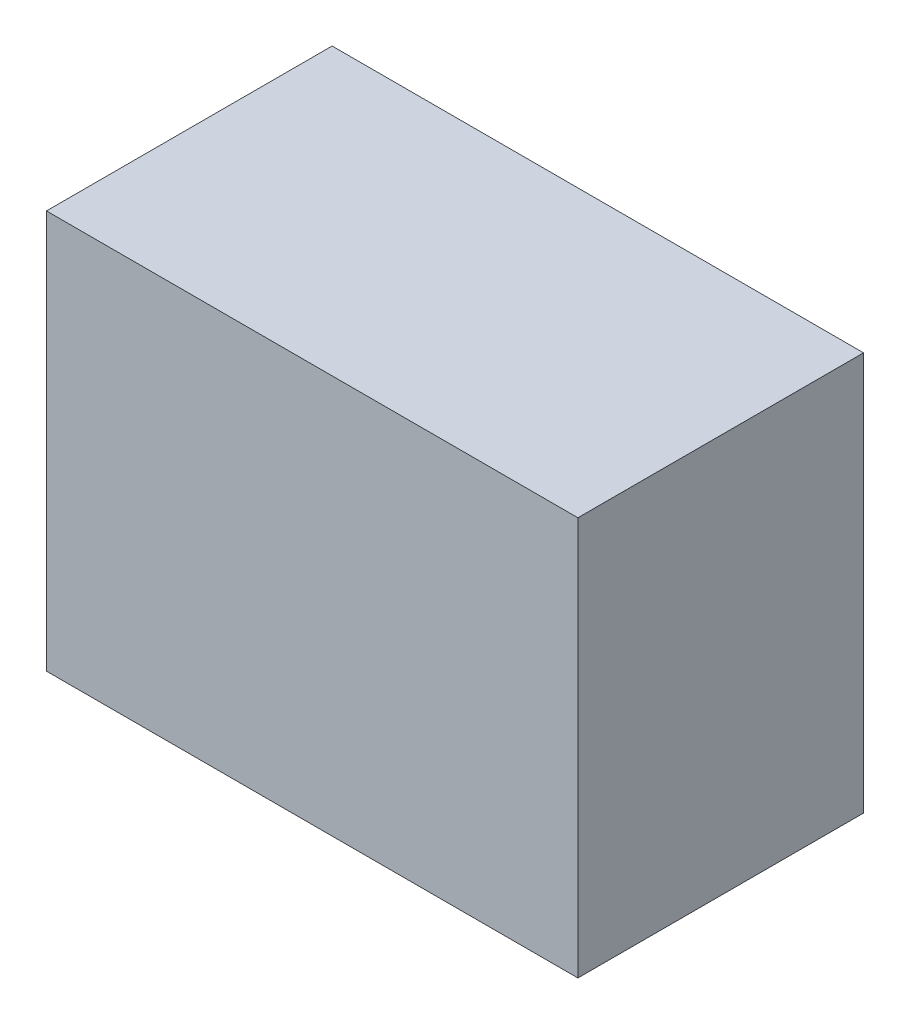
ISO-10303-21;
HEADER;
FILE_DESCRIPTION(('STEP AP214'),'2;1');
FILE_NAME('part.step','',(''),(''),'','','');
FILE_SCHEMA(('AUTOMOTIVE_DESIGN { 1 0 10303 214 1 1 1 1 }'));
ENDSEC;
DATA;
#1=APPLICATION_CONTEXT('core data for automotive mechanical design processes');
#2=APPLICATION_PROTOCOL_DEFINITION('international standard','automotive_design',2000,#1);
#3=PRODUCT_CONTEXT('',#1,'mechanical');
#4=PRODUCT('Part','Part','',(#3));
#5=PRODUCT_RELATED_PRODUCT_CATEGORY('part','',(#4));
#6=PRODUCT_DEFINITION_FORMATION('','',#4);
#7=PRODUCT_DEFINITION_CONTEXT('part definition',#1,'design');
#8=PRODUCT_DEFINITION('design','',#6,#7);
#9=PRODUCT_DEFINITION_SHAPE('','',#8);
#10=(LENGTH_UNIT() NAMED_UNIT(*) SI_UNIT(.MILLI.,.METRE.));
#11=(NAMED_UNIT(*) PLANE_ANGLE_UNIT() SI_UNIT($,.RADIAN.));
#12=(NAMED_UNIT(*) SI_UNIT($,.STERADIAN.) SOLID_ANGLE_UNIT());
#13=UNCERTAINTY_MEASURE_WITH_UNIT(LENGTH_MEASURE(1.E-05),#10,'distance_accuracy_value','');
#14=(GEOMETRIC_REPRESENTATION_CONTEXT(3) GLOBAL_UNCERTAINTY_ASSIGNED_CONTEXT((#13)) GLOBAL_UNIT_ASSIGNED_CONTEXT((#10,
#11,#12)) REPRESENTATION_CONTEXT('',''));
#15=CARTESIAN_POINT('',(0.,0.,0.));
#16=DIRECTION('',(0.,0.,1.));
#17=DIRECTION('',(1.,0.,0.));
#18=AXIS2_PLACEMENT_3D('',#15,#16,#17);
#19=CARTESIAN_POINT('',(2.125571811397E-07,1.110582219952E-06,0.86000082));
#20=DIRECTION('',(0.,0.,1.));
#21=DIRECTION('',(1.,0.,0.));
#22=AXIS2_PLACEMENT_3D('',#19,#20,#21);
#23=PLANE('',#22);
#24=DIRECTION('',(0.,1.,0.));
#25=VECTOR('',#24,1.);
#26=CARTESIAN_POINT('',(-0.80000094,0.5999988,0.86000082));
#27=LINE('',#26,#25);
#28=CARTESIAN_POINT('',(-0.79999967,0.600000705,0.86000082));
#29=VERTEX_POINT('',#28);
#30=CARTESIAN_POINT('',(-0.80000094,-0.5999988,0.86000082));
#31=VERTEX_POINT('',#30);
#32=EDGE_CURVE('E76',#29,#31,#27,.F.);
#33=ORIENTED_EDGE('',*,*,#32,.T.);
#34=DIRECTION('',(1.,0.,0.));
#35=VECTOR('',#34,1.);
#36=CARTESIAN_POINT('',(-0.80000094,-0.5999988,0.86000082));
#37=LINE('',#36,#35);
#38=CARTESIAN_POINT('',(0.80000094,-0.5999988,0.86000082));
#39=VERTEX_POINT('',#38);
#40=EDGE_CURVE('E58',#31,#39,#37,.T.);
#41=ORIENTED_EDGE('',*,*,#40,.T.);
#42=DIRECTION('',(0.,1.,0.));
#43=VECTOR('',#42,1.);
#44=CARTESIAN_POINT('',(0.80000094,-0.5999988,0.86000082));
#45=LINE('',#44,#43);
#46=CARTESIAN_POINT('',(0.80000094,0.60000134,0.86000082));
#47=VERTEX_POINT('',#46);
#48=EDGE_CURVE('E20',#39,#47,#45,.T.);
#49=ORIENTED_EDGE('',*,*,#48,.T.);
#50=DIRECTION('',(1.,0.,0.));
#51=VECTOR('',#50,1.);
#52=CARTESIAN_POINT('',(0.80000094,0.60000134,0.86000082));
#53=LINE('',#52,#51);
#54=EDGE_CURVE('E55',#47,#29,#53,.F.);
#55=ORIENTED_EDGE('',*,*,#54,.T.);
#56=EDGE_LOOP('',(#33,#41,#49,#55));
#57=FACE_BOUND('',#56,.T.);
#58=ADVANCED_FACE('F17',(#57),#23,.T.);
#59=CARTESIAN_POINT('',(0.80000094,-0.5999988,0.));
#60=DIRECTION('',(-1.,0.,0.));
#61=DIRECTION('',(0.,0.,1.));
#62=AXIS2_PLACEMENT_3D('',#59,#60,#61);
#63=PLANE('',#62);
#64=DIRECTION('',(0.,0.,-1.));
#65=VECTOR('',#64,1.);
#66=CARTESIAN_POINT('',(0.80000094,0.60000134,0.));
#67=LINE('',#66,#65);
#68=CARTESIAN_POINT('',(0.80000094,0.60000134,0.));
#69=VERTEX_POINT('',#68);
#70=EDGE_CURVE('E63',#69,#47,#67,.F.);
#71=ORIENTED_EDGE('',*,*,#70,.T.);
#72=ORIENTED_EDGE('',*,*,#48,.F.);
#73=DIRECTION('',(0.,0.,1.));
#74=VECTOR('',#73,1.);
#75=CARTESIAN_POINT('',(0.80000094,-0.5999988,0.));
#76=LINE('',#75,#74);
#77=CARTESIAN_POINT('',(0.80000094,-0.5999988,0.));
#78=VERTEX_POINT('',#77);
#79=EDGE_CURVE('E80',#39,#78,#76,.F.);
#80=ORIENTED_EDGE('',*,*,#79,.T.);
#81=DIRECTION('',(0.,1.,0.));
#82=VECTOR('',#81,1.);
#83=CARTESIAN_POINT('',(0.80000094,1.110582219952E-06,0.));
#84=LINE('',#83,#82);
#85=EDGE_CURVE('E73',#78,#69,#84,.T.);
#86=ORIENTED_EDGE('',*,*,#85,.T.);
#87=EDGE_LOOP('',(#71,#72,#80,#86));
#88=FACE_BOUND('',#87,.T.);
#89=ADVANCED_FACE('F72',(#88),#63,.F.);
#90=CARTESIAN_POINT('',(0.80000094,0.60000134,0.));
#91=DIRECTION('',(0.,-1.,0.));
#92=DIRECTION('',(0.,0.,-1.));
#93=AXIS2_PLACEMENT_3D('',#90,#91,#92);
#94=PLANE('',#93);
#95=DIRECTION('',(0.,0.,-1.));
#96=VECTOR('',#95,1.);
#97=CARTESIAN_POINT('',(-0.80000094,0.5999988,0.));
#98=LINE('',#97,#96);
#99=CARTESIAN_POINT('',(-0.79999967,0.600000705,0.));
#100=VERTEX_POINT('',#99);
#101=EDGE_CURVE('E69',#100,#29,#98,.F.);
#102=ORIENTED_EDGE('',*,*,#101,.T.);
#103=ORIENTED_EDGE('',*,*,#54,.F.);
#104=ORIENTED_EDGE('',*,*,#70,.F.);
#105=DIRECTION('',(1.,0.,0.));
#106=VECTOR('',#105,1.);
#107=CARTESIAN_POINT('',(2.125571811397E-07,0.60000134,0.));
#108=LINE('',#107,#106);
#109=EDGE_CURVE('E83',#69,#100,#108,.F.);
#110=ORIENTED_EDGE('',*,*,#109,.T.);
#111=EDGE_LOOP('',(#102,#103,#104,#110));
#112=FACE_BOUND('',#111,.T.);
#113=ADVANCED_FACE('F66',(#112),#94,.F.);
#114=CARTESIAN_POINT('',(-0.80000094,0.5999988,0.));
#115=DIRECTION('',(1.,0.,0.));
#116=DIRECTION('',(0.,0.,-1.));
#117=AXIS2_PLACEMENT_3D('',#114,#115,#116);
#118=PLANE('',#117);
#119=DIRECTION('',(0.,0.,1.));
#120=VECTOR('',#119,1.);
#121=CARTESIAN_POINT('',(-0.80000094,-0.5999988,0.));
#122=LINE('',#121,#120);
#123=CARTESIAN_POINT('',(-0.80000094,-0.5999988,0.));
#124=VERTEX_POINT('',#123);
#125=EDGE_CURVE('E34',#124,#31,#122,.T.);
#126=ORIENTED_EDGE('',*,*,#125,.T.);
#127=ORIENTED_EDGE('',*,*,#32,.F.);
#128=ORIENTED_EDGE('',*,*,#101,.F.);
#129=DIRECTION('',(0.,1.,0.));
#130=VECTOR('',#129,1.);
#131=CARTESIAN_POINT('',(-0.80000094,1.110582219952E-06,0.));
#132=LINE('',#131,#130);
#133=EDGE_CURVE('E26',#100,#124,#132,.F.);
#134=ORIENTED_EDGE('',*,*,#133,.T.);
#135=EDGE_LOOP('',(#126,#127,#128,#134));
#136=FACE_BOUND('',#135,.T.);
#137=ADVANCED_FACE('F88',(#136),#118,.F.);
#138=CARTESIAN_POINT('',(-0.80000094,-0.5999988,0.));
#139=DIRECTION('',(0.,1.,0.));
#140=DIRECTION('',(0.,0.,1.));
#141=AXIS2_PLACEMENT_3D('',#138,#139,#140);
#142=PLANE('',#141);
#143=ORIENTED_EDGE('',*,*,#79,.F.);
#144=ORIENTED_EDGE('',*,*,#40,.F.);
#145=ORIENTED_EDGE('',*,*,#125,.F.);
#146=DIRECTION('',(1.,0.,0.));
#147=VECTOR('',#146,1.);
#148=CARTESIAN_POINT('',(2.125571811397E-07,-0.5999988,0.));
#149=LINE('',#148,#147);
#150=EDGE_CURVE('E11',#124,#78,#149,.T.);
#151=ORIENTED_EDGE('',*,*,#150,.T.);
#152=EDGE_LOOP('',(#143,#144,#145,#151));
#153=FACE_BOUND('',#152,.T.);
#154=ADVANCED_FACE('F91',(#153),#142,.F.);
#155=CARTESIAN_POINT('',(2.125571811397E-07,1.110582219952E-06,0.));
#156=DIRECTION('',(0.,0.,1.));
#157=DIRECTION('',(1.,0.,0.));
#158=AXIS2_PLACEMENT_3D('',#155,#156,#157);
#159=PLANE('',#158);
#160=ORIENTED_EDGE('',*,*,#133,.F.);
#161=ORIENTED_EDGE('',*,*,#109,.F.);
#162=ORIENTED_EDGE('',*,*,#85,.F.);
#163=ORIENTED_EDGE('',*,*,#150,.F.);
#164=EDGE_LOOP('',(#160,#161,#162,#163));
#165=FACE_BOUND('',#164,.T.);
#166=ADVANCED_FACE('F90',(#165),#159,.F.);
#167=CLOSED_SHELL('',(#58,#89,#113,#137,#154,#166));
#168=MANIFOLD_SOLID_BREP('B1',#167);
#169=ADVANCED_BREP_SHAPE_REPRESENTATION('',(#18,#168),#14);
#170=SHAPE_DEFINITION_REPRESENTATION(#9,#169);
ENDSEC;
END-ISO-10303-21;
